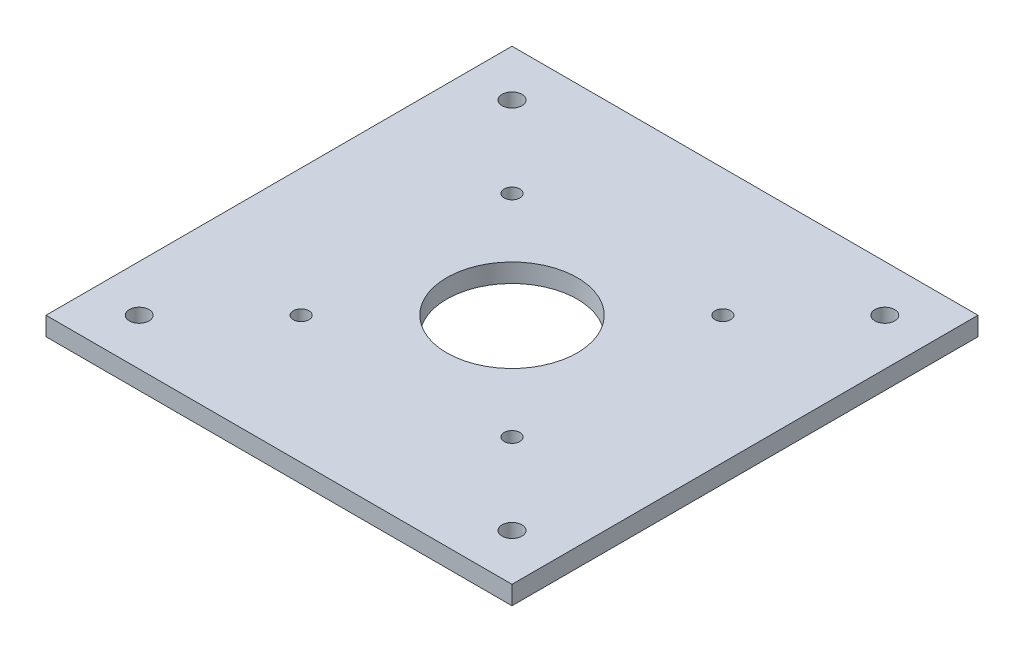
ISO-10303-21;
HEADER;
FILE_DESCRIPTION(('STEP AP214'),'2;1');
FILE_NAME('part.step','',(''),(''),'','','');
FILE_SCHEMA(('AUTOMOTIVE_DESIGN { 1 0 10303 214 1 1 1 1 }'));
ENDSEC;
DATA;
#1=APPLICATION_CONTEXT('core data for automotive mechanical design processes');
#2=APPLICATION_PROTOCOL_DEFINITION('international standard','automotive_design',2000,#1);
#3=PRODUCT_CONTEXT('',#1,'mechanical');
#4=PRODUCT('Part','Part','',(#3));
#5=PRODUCT_RELATED_PRODUCT_CATEGORY('part','',(#4));
#6=PRODUCT_DEFINITION_FORMATION('','',#4);
#7=PRODUCT_DEFINITION_CONTEXT('part definition',#1,'design');
#8=PRODUCT_DEFINITION('design','',#6,#7);
#9=PRODUCT_DEFINITION_SHAPE('','',#8);
#10=(LENGTH_UNIT() NAMED_UNIT(*) SI_UNIT(.MILLI.,.METRE.));
#11=(NAMED_UNIT(*) PLANE_ANGLE_UNIT() SI_UNIT($,.RADIAN.));
#12=(NAMED_UNIT(*) SI_UNIT($,.STERADIAN.) SOLID_ANGLE_UNIT());
#13=UNCERTAINTY_MEASURE_WITH_UNIT(LENGTH_MEASURE(1.E-05),#10,'distance_accuracy_value','');
#14=(GEOMETRIC_REPRESENTATION_CONTEXT(3) GLOBAL_UNCERTAINTY_ASSIGNED_CONTEXT((#13)) GLOBAL_UNIT_ASSIGNED_CONTEXT((#10,
#11,#12)) REPRESENTATION_CONTEXT('',''));
#15=CARTESIAN_POINT('',(0.,0.,0.));
#16=DIRECTION('',(0.,0.,1.));
#17=DIRECTION('',(1.,0.,0.));
#18=AXIS2_PLACEMENT_3D('',#15,#16,#17);
#19=CARTESIAN_POINT('',(62.5,5.,62.5));
#20=DIRECTION('',(-1.,0.,0.));
#21=DIRECTION('',(0.,0.,1.));
#22=AXIS2_PLACEMENT_3D('',#19,#20,#21);
#23=PLANE('',#22);
#24=DIRECTION('',(0.,0.,-1.));
#25=VECTOR('',#24,1.);
#26=CARTESIAN_POINT('',(62.5,0.,62.5));
#27=LINE('',#26,#25);
#28=CARTESIAN_POINT('',(62.5,0.,62.5));
#29=VERTEX_POINT('',#28);
#30=CARTESIAN_POINT('',(62.5,0.,-62.5));
#31=VERTEX_POINT('',#30);
#32=EDGE_CURVE('E95',#29,#31,#27,.T.);
#33=ORIENTED_EDGE('',*,*,#32,.T.);
#34=DIRECTION('',(0.,-1.,0.));
#35=VECTOR('',#34,1.);
#36=CARTESIAN_POINT('',(62.5,5.,-62.5));
#37=LINE('',#36,#35);
#38=CARTESIAN_POINT('',(62.5,5.,-62.5));
#39=VERTEX_POINT('',#38);
#40=EDGE_CURVE('E11',#39,#31,#37,.T.);
#41=ORIENTED_EDGE('',*,*,#40,.F.);
#42=DIRECTION('',(0.,0.,-1.));
#43=VECTOR('',#42,1.);
#44=CARTESIAN_POINT('',(62.5,5.,62.5));
#45=LINE('',#44,#43);
#46=CARTESIAN_POINT('',(62.5,5.,62.5));
#47=VERTEX_POINT('',#46);
#48=EDGE_CURVE('E83',#47,#39,#45,.T.);
#49=ORIENTED_EDGE('',*,*,#48,.F.);
#50=DIRECTION('',(0.,-1.,0.));
#51=VECTOR('',#50,1.);
#52=CARTESIAN_POINT('',(62.5,5.,62.5));
#53=LINE('',#52,#51);
#54=EDGE_CURVE('E91',#47,#29,#53,.T.);
#55=ORIENTED_EDGE('',*,*,#54,.T.);
#56=EDGE_LOOP('',(#33,#41,#49,#55));
#57=FACE_BOUND('',#56,.T.);
#58=ADVANCED_FACE('F32',(#57),#23,.F.);
#59=CARTESIAN_POINT('',(-62.5,5.,-62.5));
#60=DIRECTION('',(0.,0.,1.));
#61=DIRECTION('',(1.,0.,0.));
#62=AXIS2_PLACEMENT_3D('',#59,#60,#61);
#63=PLANE('',#62);
#64=DIRECTION('',(-1.,0.,0.));
#65=VECTOR('',#64,1.);
#66=CARTESIAN_POINT('',(-62.5,0.,-62.5));
#67=LINE('',#66,#65);
#68=CARTESIAN_POINT('',(-62.5,0.,-62.5));
#69=VERTEX_POINT('',#68);
#70=EDGE_CURVE('E87',#31,#69,#67,.T.);
#71=ORIENTED_EDGE('',*,*,#70,.T.);
#72=DIRECTION('',(0.,-1.,0.));
#73=VECTOR('',#72,1.);
#74=CARTESIAN_POINT('',(-62.5,5.,-62.5));
#75=LINE('',#74,#73);
#76=CARTESIAN_POINT('',(-62.5,5.,-62.5));
#77=VERTEX_POINT('',#76);
#78=EDGE_CURVE('E40',#77,#69,#75,.T.);
#79=ORIENTED_EDGE('',*,*,#78,.F.);
#80=DIRECTION('',(-1.,0.,0.));
#81=VECTOR('',#80,1.);
#82=CARTESIAN_POINT('',(-62.5,5.,-62.5));
#83=LINE('',#82,#81);
#84=EDGE_CURVE('E78',#39,#77,#83,.T.);
#85=ORIENTED_EDGE('',*,*,#84,.F.);
#86=ORIENTED_EDGE('',*,*,#40,.T.);
#87=EDGE_LOOP('',(#71,#79,#85,#86));
#88=FACE_BOUND('',#87,.T.);
#89=ADVANCED_FACE('F86',(#88),#63,.F.);
#90=CARTESIAN_POINT('',(-62.5,5.,62.5));
#91=DIRECTION('',(1.,0.,0.));
#92=DIRECTION('',(0.,0.,-1.));
#93=AXIS2_PLACEMENT_3D('',#90,#91,#92);
#94=PLANE('',#93);
#95=DIRECTION('',(0.,0.,1.));
#96=VECTOR('',#95,1.);
#97=CARTESIAN_POINT('',(-62.5,0.,62.5));
#98=LINE('',#97,#96);
#99=CARTESIAN_POINT('',(-62.5,0.,62.5));
#100=VERTEX_POINT('',#99);
#101=EDGE_CURVE('E65',#69,#100,#98,.T.);
#102=ORIENTED_EDGE('',*,*,#101,.T.);
#103=DIRECTION('',(0.,-1.,0.));
#104=VECTOR('',#103,1.);
#105=CARTESIAN_POINT('',(-62.5,5.,62.5));
#106=LINE('',#105,#104);
#107=CARTESIAN_POINT('',(-62.5,5.,62.5));
#108=VERTEX_POINT('',#107);
#109=EDGE_CURVE('E88',#108,#100,#106,.T.);
#110=ORIENTED_EDGE('',*,*,#109,.F.);
#111=DIRECTION('',(0.,0.,1.));
#112=VECTOR('',#111,1.);
#113=CARTESIAN_POINT('',(-62.5,5.,62.5));
#114=LINE('',#113,#112);
#115=EDGE_CURVE('E81',#77,#108,#114,.T.);
#116=ORIENTED_EDGE('',*,*,#115,.F.);
#117=ORIENTED_EDGE('',*,*,#78,.T.);
#118=EDGE_LOOP('',(#102,#110,#116,#117));
#119=FACE_BOUND('',#118,.T.);
#120=ADVANCED_FACE('F89',(#119),#94,.F.);
#121=CARTESIAN_POINT('',(-62.5,5.,62.5));
#122=DIRECTION('',(0.,0.,-1.));
#123=DIRECTION('',(-1.,0.,0.));
#124=AXIS2_PLACEMENT_3D('',#121,#122,#123);
#125=PLANE('',#124);
#126=DIRECTION('',(1.,0.,0.));
#127=VECTOR('',#126,1.);
#128=CARTESIAN_POINT('',(-62.5,0.,62.5));
#129=LINE('',#128,#127);
#130=EDGE_CURVE('E71',#100,#29,#129,.T.);
#131=ORIENTED_EDGE('',*,*,#130,.T.);
#132=ORIENTED_EDGE('',*,*,#54,.F.);
#133=DIRECTION('',(1.,0.,0.));
#134=VECTOR('',#133,1.);
#135=CARTESIAN_POINT('',(-62.5,5.,62.5));
#136=LINE('',#135,#134);
#137=EDGE_CURVE('E48',#108,#47,#136,.T.);
#138=ORIENTED_EDGE('',*,*,#137,.F.);
#139=ORIENTED_EDGE('',*,*,#109,.T.);
#140=EDGE_LOOP('',(#131,#132,#138,#139));
#141=FACE_BOUND('',#140,.T.);
#142=ADVANCED_FACE('F103',(#141),#125,.F.);
#143=CARTESIAN_POINT('',(0.,5.,0.));
#144=DIRECTION('',(0.,-1.,0.));
#145=DIRECTION('',(0.,0.,-1.));
#146=AXIS2_PLACEMENT_3D('',#143,#144,#145);
#147=PLANE('',#146);
#148=CARTESIAN_POINT('',(-50.,5.,50.));
#149=DIRECTION('',(0.,1.,0.));
#150=DIRECTION('',(0.,0.,1.));
#151=AXIS2_PLACEMENT_3D('',#148,#149,#150);
#152=CIRCLE('',#151,2.65);
#153=CARTESIAN_POINT('',(-50.,5.,52.65));
#154=VERTEX_POINT('',#153);
#155=EDGE_CURVE('E159',#154,#154,#152,.T.);
#156=ORIENTED_EDGE('',*,*,#155,.F.);
#157=EDGE_LOOP('',(#156));
#158=FACE_BOUND('',#157,.T.);
#159=CARTESIAN_POINT('',(-50.,5.,-50.));
#160=DIRECTION('',(0.,1.,0.));
#161=DIRECTION('',(0.,0.,1.));
#162=AXIS2_PLACEMENT_3D('',#159,#160,#161);
#163=CIRCLE('',#162,2.65);
#164=CARTESIAN_POINT('',(-50.,5.,-47.35));
#165=VERTEX_POINT('',#164);
#166=EDGE_CURVE('E153',#165,#165,#163,.T.);
#167=ORIENTED_EDGE('',*,*,#166,.F.);
#168=EDGE_LOOP('',(#167));
#169=FACE_BOUND('',#168,.T.);
#170=CARTESIAN_POINT('',(50.,5.,-50.));
#171=DIRECTION('',(0.,1.,0.));
#172=DIRECTION('',(0.,0.,1.));
#173=AXIS2_PLACEMENT_3D('',#170,#171,#172);
#174=CIRCLE('',#173,2.65);
#175=CARTESIAN_POINT('',(50.,5.,-47.35));
#176=VERTEX_POINT('',#175);
#177=EDGE_CURVE('E147',#176,#176,#174,.T.);
#178=ORIENTED_EDGE('',*,*,#177,.F.);
#179=EDGE_LOOP('',(#178));
#180=FACE_BOUND('',#179,.T.);
#181=CARTESIAN_POINT('',(50.,5.,50.));
#182=DIRECTION('',(0.,1.,0.));
#183=DIRECTION('',(0.,0.,1.));
#184=AXIS2_PLACEMENT_3D('',#181,#182,#183);
#185=CIRCLE('',#184,2.65);
#186=CARTESIAN_POINT('',(50.,5.,52.65));
#187=VERTEX_POINT('',#186);
#188=EDGE_CURVE('E141',#187,#187,#185,.T.);
#189=ORIENTED_EDGE('',*,*,#188,.F.);
#190=EDGE_LOOP('',(#189));
#191=FACE_BOUND('',#190,.T.);
#192=CARTESIAN_POINT('',(28.2842712474619,5.,-28.2842712474619));
#193=DIRECTION('',(0.,1.,0.));
#194=DIRECTION('',(0.,0.,1.));
#195=AXIS2_PLACEMENT_3D('',#192,#193,#194);
#196=CIRCLE('',#195,2.1);
#197=CARTESIAN_POINT('',(28.2842712474619,5.,-26.1842712474619));
#198=VERTEX_POINT('',#197);
#199=EDGE_CURVE('E135',#198,#198,#196,.T.);
#200=ORIENTED_EDGE('',*,*,#199,.F.);
#201=EDGE_LOOP('',(#200));
#202=FACE_BOUND('',#201,.T.);
#203=CARTESIAN_POINT('',(28.2842712474619,5.,28.2842712474619));
#204=DIRECTION('',(0.,1.,0.));
#205=DIRECTION('',(0.,0.,1.));
#206=AXIS2_PLACEMENT_3D('',#203,#204,#205);
#207=CIRCLE('',#206,2.1);
#208=CARTESIAN_POINT('',(28.2842712474619,5.,30.3842712474619));
#209=VERTEX_POINT('',#208);
#210=EDGE_CURVE('E129',#209,#209,#207,.T.);
#211=ORIENTED_EDGE('',*,*,#210,.F.);
#212=EDGE_LOOP('',(#211));
#213=FACE_BOUND('',#212,.T.);
#214=CARTESIAN_POINT('',(-28.2842712474619,5.,28.2842712474619));
#215=DIRECTION('',(0.,1.,0.));
#216=DIRECTION('',(0.,0.,1.));
#217=AXIS2_PLACEMENT_3D('',#214,#215,#216);
#218=CIRCLE('',#217,2.1);
#219=CARTESIAN_POINT('',(-28.2842712474619,5.,30.3842712474619));
#220=VERTEX_POINT('',#219);
#221=EDGE_CURVE('E123',#220,#220,#218,.T.);
#222=ORIENTED_EDGE('',*,*,#221,.F.);
#223=EDGE_LOOP('',(#222));
#224=FACE_BOUND('',#223,.T.);
#225=CARTESIAN_POINT('',(-28.2842712474619,5.,-28.2842712474619));
#226=DIRECTION('',(0.,1.,0.));
#227=DIRECTION('',(0.,0.,1.));
#228=AXIS2_PLACEMENT_3D('',#225,#226,#227);
#229=CIRCLE('',#228,2.1);
#230=CARTESIAN_POINT('',(-28.2842712474619,5.,-26.1842712474619));
#231=VERTEX_POINT('',#230);
#232=EDGE_CURVE('E117',#231,#231,#229,.T.);
#233=ORIENTED_EDGE('',*,*,#232,.F.);
#234=EDGE_LOOP('',(#233));
#235=FACE_BOUND('',#234,.T.);
#236=CARTESIAN_POINT('',(0.,5.,0.));
#237=DIRECTION('',(0.,1.,0.));
#238=DIRECTION('',(0.,0.,1.));
#239=AXIS2_PLACEMENT_3D('',#236,#237,#238);
#240=CIRCLE('',#239,17.5);
#241=CARTESIAN_POINT('',(0.,5.,17.5));
#242=VERTEX_POINT('',#241);
#243=EDGE_CURVE('E109',#242,#242,#240,.T.);
#244=ORIENTED_EDGE('',*,*,#243,.F.);
#245=EDGE_LOOP('',(#244));
#246=FACE_BOUND('',#245,.T.);
#247=ORIENTED_EDGE('',*,*,#48,.T.);
#248=ORIENTED_EDGE('',*,*,#84,.T.);
#249=ORIENTED_EDGE('',*,*,#115,.T.);
#250=ORIENTED_EDGE('',*,*,#137,.T.);
#251=EDGE_LOOP('',(#247,#248,#249,#250));
#252=FACE_BOUND('',#251,.T.);
#253=ADVANCED_FACE('F79',(#158,#169,#180,#191,#202,#213,#224,#235,#246,#252),#147,.F.);
#254=CARTESIAN_POINT('',(0.,0.,0.));
#255=DIRECTION('',(0.,-1.,0.));
#256=DIRECTION('',(0.,0.,-1.));
#257=AXIS2_PLACEMENT_3D('',#254,#255,#256);
#258=PLANE('',#257);
#259=CARTESIAN_POINT('',(-50.,0.,50.));
#260=DIRECTION('',(0.,1.,0.));
#261=DIRECTION('',(0.,0.,1.));
#262=AXIS2_PLACEMENT_3D('',#259,#260,#261);
#263=CIRCLE('',#262,2.65);
#264=CARTESIAN_POINT('',(-50.,0.,52.65));
#265=VERTEX_POINT('',#264);
#266=EDGE_CURVE('E156',#265,#265,#263,.T.);
#267=ORIENTED_EDGE('',*,*,#266,.T.);
#268=EDGE_LOOP('',(#267));
#269=FACE_BOUND('',#268,.T.);
#270=CARTESIAN_POINT('',(-50.,0.,-50.));
#271=DIRECTION('',(0.,1.,0.));
#272=DIRECTION('',(0.,0.,1.));
#273=AXIS2_PLACEMENT_3D('',#270,#271,#272);
#274=CIRCLE('',#273,2.65);
#275=CARTESIAN_POINT('',(-50.,0.,-47.35));
#276=VERTEX_POINT('',#275);
#277=EDGE_CURVE('E150',#276,#276,#274,.T.);
#278=ORIENTED_EDGE('',*,*,#277,.T.);
#279=EDGE_LOOP('',(#278));
#280=FACE_BOUND('',#279,.T.);
#281=CARTESIAN_POINT('',(50.,0.,-50.));
#282=DIRECTION('',(0.,1.,0.));
#283=DIRECTION('',(0.,0.,1.));
#284=AXIS2_PLACEMENT_3D('',#281,#282,#283);
#285=CIRCLE('',#284,2.65);
#286=CARTESIAN_POINT('',(50.,0.,-47.35));
#287=VERTEX_POINT('',#286);
#288=EDGE_CURVE('E144',#287,#287,#285,.T.);
#289=ORIENTED_EDGE('',*,*,#288,.T.);
#290=EDGE_LOOP('',(#289));
#291=FACE_BOUND('',#290,.T.);
#292=CARTESIAN_POINT('',(50.,0.,50.));
#293=DIRECTION('',(0.,1.,0.));
#294=DIRECTION('',(0.,0.,1.));
#295=AXIS2_PLACEMENT_3D('',#292,#293,#294);
#296=CIRCLE('',#295,2.65);
#297=CARTESIAN_POINT('',(50.,0.,52.65));
#298=VERTEX_POINT('',#297);
#299=EDGE_CURVE('E138',#298,#298,#296,.T.);
#300=ORIENTED_EDGE('',*,*,#299,.T.);
#301=EDGE_LOOP('',(#300));
#302=FACE_BOUND('',#301,.T.);
#303=CARTESIAN_POINT('',(28.2842712474619,0.,-28.2842712474619));
#304=DIRECTION('',(0.,1.,0.));
#305=DIRECTION('',(0.,0.,1.));
#306=AXIS2_PLACEMENT_3D('',#303,#304,#305);
#307=CIRCLE('',#306,2.1);
#308=CARTESIAN_POINT('',(28.2842712474619,0.,-26.1842712474619));
#309=VERTEX_POINT('',#308);
#310=EDGE_CURVE('E132',#309,#309,#307,.T.);
#311=ORIENTED_EDGE('',*,*,#310,.T.);
#312=EDGE_LOOP('',(#311));
#313=FACE_BOUND('',#312,.T.);
#314=CARTESIAN_POINT('',(28.2842712474619,0.,28.2842712474619));
#315=DIRECTION('',(0.,1.,0.));
#316=DIRECTION('',(0.,0.,1.));
#317=AXIS2_PLACEMENT_3D('',#314,#315,#316);
#318=CIRCLE('',#317,2.1);
#319=CARTESIAN_POINT('',(28.2842712474619,0.,30.3842712474619));
#320=VERTEX_POINT('',#319);
#321=EDGE_CURVE('E126',#320,#320,#318,.T.);
#322=ORIENTED_EDGE('',*,*,#321,.T.);
#323=EDGE_LOOP('',(#322));
#324=FACE_BOUND('',#323,.T.);
#325=CARTESIAN_POINT('',(-28.2842712474619,0.,28.2842712474619));
#326=DIRECTION('',(0.,1.,0.));
#327=DIRECTION('',(0.,0.,1.));
#328=AXIS2_PLACEMENT_3D('',#325,#326,#327);
#329=CIRCLE('',#328,2.1);
#330=CARTESIAN_POINT('',(-28.2842712474619,0.,30.3842712474619));
#331=VERTEX_POINT('',#330);
#332=EDGE_CURVE('E120',#331,#331,#329,.T.);
#333=ORIENTED_EDGE('',*,*,#332,.T.);
#334=EDGE_LOOP('',(#333));
#335=FACE_BOUND('',#334,.T.);
#336=CARTESIAN_POINT('',(-28.2842712474619,0.,-28.2842712474619));
#337=DIRECTION('',(0.,1.,0.));
#338=DIRECTION('',(0.,0.,1.));
#339=AXIS2_PLACEMENT_3D('',#336,#337,#338);
#340=CIRCLE('',#339,2.1);
#341=CARTESIAN_POINT('',(-28.2842712474619,0.,-26.1842712474619));
#342=VERTEX_POINT('',#341);
#343=EDGE_CURVE('E112',#342,#342,#340,.T.);
#344=ORIENTED_EDGE('',*,*,#343,.T.);
#345=EDGE_LOOP('',(#344));
#346=FACE_BOUND('',#345,.T.);
#347=CARTESIAN_POINT('',(0.,0.,0.));
#348=DIRECTION('',(0.,1.,0.));
#349=DIRECTION('',(0.,0.,1.));
#350=AXIS2_PLACEMENT_3D('',#347,#348,#349);
#351=CIRCLE('',#350,17.5);
#352=CARTESIAN_POINT('',(0.,0.,17.5));
#353=VERTEX_POINT('',#352);
#354=EDGE_CURVE('E98',#353,#353,#351,.T.);
#355=ORIENTED_EDGE('',*,*,#354,.T.);
#356=EDGE_LOOP('',(#355));
#357=FACE_BOUND('',#356,.T.);
#358=ORIENTED_EDGE('',*,*,#32,.F.);
#359=ORIENTED_EDGE('',*,*,#130,.F.);
#360=ORIENTED_EDGE('',*,*,#101,.F.);
#361=ORIENTED_EDGE('',*,*,#70,.F.);
#362=EDGE_LOOP('',(#358,#359,#360,#361));
#363=FACE_BOUND('',#362,.T.);
#364=ADVANCED_FACE('F106',(#269,#280,#291,#302,#313,#324,#335,#346,#357,#363),#258,.T.);
#365=CARTESIAN_POINT('',(0.,0.,0.));
#366=DIRECTION('',(0.,1.,0.));
#367=DIRECTION('',(0.,0.,1.));
#368=AXIS2_PLACEMENT_3D('',#365,#366,#367);
#369=CYLINDRICAL_SURFACE('',#368,17.5);
#370=ORIENTED_EDGE('',*,*,#354,.F.);
#371=EDGE_LOOP('',(#370));
#372=FACE_BOUND('',#371,.T.);
#373=ORIENTED_EDGE('',*,*,#243,.T.);
#374=EDGE_LOOP('',(#373));
#375=FACE_BOUND('',#374,.T.);
#376=ADVANCED_FACE('F184',(#372,#375),#369,.F.);
#377=CARTESIAN_POINT('',(-28.2842712474619,5.,-28.2842712474619));
#378=DIRECTION('',(0.,1.,0.));
#379=DIRECTION('',(0.,0.,1.));
#380=AXIS2_PLACEMENT_3D('',#377,#378,#379);
#381=CYLINDRICAL_SURFACE('',#380,2.1);
#382=ORIENTED_EDGE('',*,*,#343,.F.);
#383=EDGE_LOOP('',(#382));
#384=FACE_BOUND('',#383,.T.);
#385=ORIENTED_EDGE('',*,*,#232,.T.);
#386=EDGE_LOOP('',(#385));
#387=FACE_BOUND('',#386,.T.);
#388=ADVANCED_FACE('F186',(#384,#387),#381,.F.);
#389=CARTESIAN_POINT('',(-28.2842712474619,5.,28.2842712474619));
#390=DIRECTION('',(0.,1.,0.));
#391=DIRECTION('',(0.,0.,1.));
#392=AXIS2_PLACEMENT_3D('',#389,#390,#391);
#393=CYLINDRICAL_SURFACE('',#392,2.1);
#394=ORIENTED_EDGE('',*,*,#332,.F.);
#395=EDGE_LOOP('',(#394));
#396=FACE_BOUND('',#395,.T.);
#397=ORIENTED_EDGE('',*,*,#221,.T.);
#398=EDGE_LOOP('',(#397));
#399=FACE_BOUND('',#398,.T.);
#400=ADVANCED_FACE('F193',(#396,#399),#393,.F.);
#401=CARTESIAN_POINT('',(28.2842712474619,5.,28.2842712474619));
#402=DIRECTION('',(0.,1.,0.));
#403=DIRECTION('',(0.,0.,1.));
#404=AXIS2_PLACEMENT_3D('',#401,#402,#403);
#405=CYLINDRICAL_SURFACE('',#404,2.1);
#406=ORIENTED_EDGE('',*,*,#321,.F.);
#407=EDGE_LOOP('',(#406));
#408=FACE_BOUND('',#407,.T.);
#409=ORIENTED_EDGE('',*,*,#210,.T.);
#410=EDGE_LOOP('',(#409));
#411=FACE_BOUND('',#410,.T.);
#412=ADVANCED_FACE('F272',(#408,#411),#405,.F.);
#413=CARTESIAN_POINT('',(28.2842712474619,5.,-28.2842712474619));
#414=DIRECTION('',(0.,1.,0.));
#415=DIRECTION('',(0.,0.,1.));
#416=AXIS2_PLACEMENT_3D('',#413,#414,#415);
#417=CYLINDRICAL_SURFACE('',#416,2.1);
#418=ORIENTED_EDGE('',*,*,#310,.F.);
#419=EDGE_LOOP('',(#418));
#420=FACE_BOUND('',#419,.T.);
#421=ORIENTED_EDGE('',*,*,#199,.T.);
#422=EDGE_LOOP('',(#421));
#423=FACE_BOUND('',#422,.T.);
#424=ADVANCED_FACE('F234',(#420,#423),#417,.F.);
#425=CARTESIAN_POINT('',(50.,5.,50.));
#426=DIRECTION('',(0.,1.,0.));
#427=DIRECTION('',(0.,0.,1.));
#428=AXIS2_PLACEMENT_3D('',#425,#426,#427);
#429=CYLINDRICAL_SURFACE('',#428,2.65);
#430=ORIENTED_EDGE('',*,*,#299,.F.);
#431=EDGE_LOOP('',(#430));
#432=FACE_BOUND('',#431,.T.);
#433=ORIENTED_EDGE('',*,*,#188,.T.);
#434=EDGE_LOOP('',(#433));
#435=FACE_BOUND('',#434,.T.);
#436=ADVANCED_FACE('F228',(#432,#435),#429,.F.);
#437=CARTESIAN_POINT('',(50.,5.,-50.));
#438=DIRECTION('',(0.,1.,0.));
#439=DIRECTION('',(0.,0.,1.));
#440=AXIS2_PLACEMENT_3D('',#437,#438,#439);
#441=CYLINDRICAL_SURFACE('',#440,2.65);
#442=ORIENTED_EDGE('',*,*,#288,.F.);
#443=EDGE_LOOP('',(#442));
#444=FACE_BOUND('',#443,.T.);
#445=ORIENTED_EDGE('',*,*,#177,.T.);
#446=EDGE_LOOP('',(#445));
#447=FACE_BOUND('',#446,.T.);
#448=ADVANCED_FACE('F233',(#444,#447),#441,.F.);
#449=CARTESIAN_POINT('',(-50.,5.,-50.));
#450=DIRECTION('',(0.,1.,0.));
#451=DIRECTION('',(0.,0.,1.));
#452=AXIS2_PLACEMENT_3D('',#449,#450,#451);
#453=CYLINDRICAL_SURFACE('',#452,2.65);
#454=ORIENTED_EDGE('',*,*,#277,.F.);
#455=EDGE_LOOP('',(#454));
#456=FACE_BOUND('',#455,.T.);
#457=ORIENTED_EDGE('',*,*,#166,.T.);
#458=EDGE_LOOP('',(#457));
#459=FACE_BOUND('',#458,.T.);
#460=ADVANCED_FACE('F246',(#456,#459),#453,.F.);
#461=CARTESIAN_POINT('',(-50.,5.,50.));
#462=DIRECTION('',(0.,1.,0.));
#463=DIRECTION('',(0.,0.,1.));
#464=AXIS2_PLACEMENT_3D('',#461,#462,#463);
#465=CYLINDRICAL_SURFACE('',#464,2.65);
#466=ORIENTED_EDGE('',*,*,#266,.F.);
#467=EDGE_LOOP('',(#466));
#468=FACE_BOUND('',#467,.T.);
#469=ORIENTED_EDGE('',*,*,#155,.T.);
#470=EDGE_LOOP('',(#469));
#471=FACE_BOUND('',#470,.T.);
#472=ADVANCED_FACE('F163',(#468,#471),#465,.F.);
#473=CLOSED_SHELL('',(#58,#89,#120,#142,#253,#364,#376,#388,#400,#412,#424,#436,#448,#460,#472));
#474=MANIFOLD_SOLID_BREP('B2',#473);
#475=ADVANCED_BREP_SHAPE_REPRESENTATION('',(#18,#474),#14);
#476=SHAPE_DEFINITION_REPRESENTATION(#9,#475);
ENDSEC;
END-ISO-10303-21;
